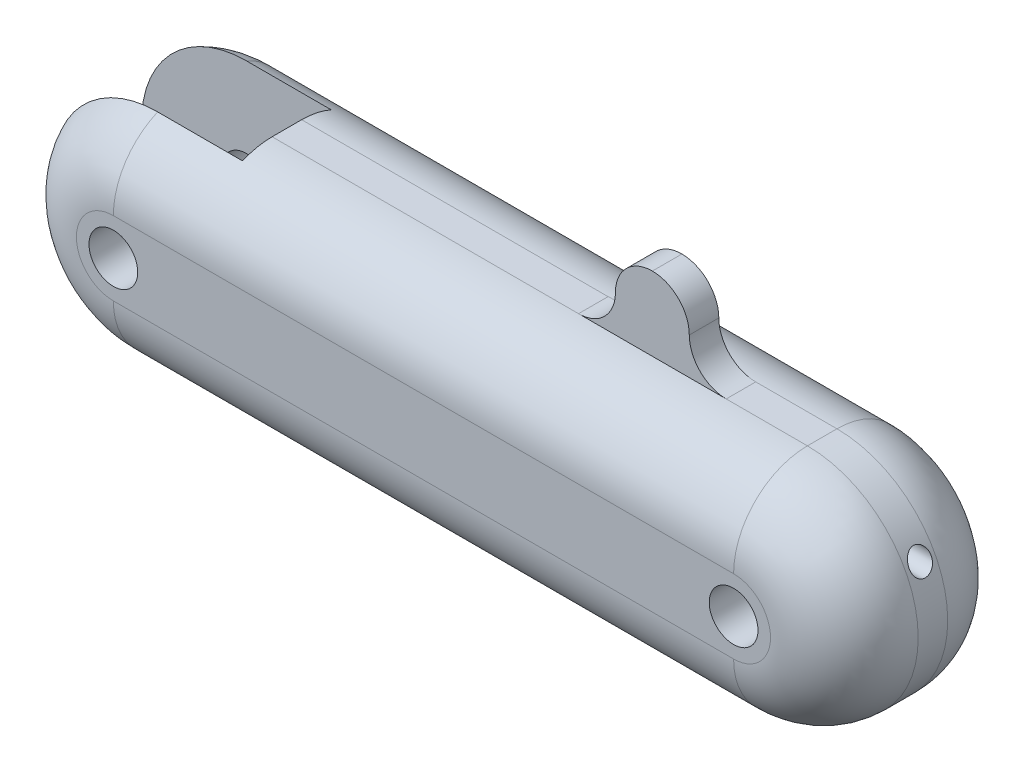
ISO-10303-21;
HEADER;
FILE_DESCRIPTION(('STEP AP214'),'2;1');
FILE_NAME('part.step','',(''),(''),'','','');
FILE_SCHEMA(('AUTOMOTIVE_DESIGN { 1 0 10303 214 1 1 1 1 }'));
ENDSEC;
DATA;
#1=APPLICATION_CONTEXT('core data for automotive mechanical design processes');
#2=APPLICATION_PROTOCOL_DEFINITION('international standard','automotive_design',2000,#1);
#3=PRODUCT_CONTEXT('',#1,'mechanical');
#4=PRODUCT('Part','Part','',(#3));
#5=PRODUCT_RELATED_PRODUCT_CATEGORY('part','',(#4));
#6=PRODUCT_DEFINITION_FORMATION('','',#4);
#7=PRODUCT_DEFINITION_CONTEXT('part definition',#1,'design');
#8=PRODUCT_DEFINITION('design','',#6,#7);
#9=PRODUCT_DEFINITION_SHAPE('','',#8);
#10=(LENGTH_UNIT() NAMED_UNIT(*) SI_UNIT(.MILLI.,.METRE.));
#11=(NAMED_UNIT(*) PLANE_ANGLE_UNIT() SI_UNIT($,.RADIAN.));
#12=(NAMED_UNIT(*) SI_UNIT($,.STERADIAN.) SOLID_ANGLE_UNIT());
#13=UNCERTAINTY_MEASURE_WITH_UNIT(LENGTH_MEASURE(1.E-05),#10,'distance_accuracy_value','');
#14=(GEOMETRIC_REPRESENTATION_CONTEXT(3) GLOBAL_UNCERTAINTY_ASSIGNED_CONTEXT((#13)) GLOBAL_UNIT_ASSIGNED_CONTEXT((#10,
#11,#12)) REPRESENTATION_CONTEXT('',''));
#15=CARTESIAN_POINT('',(0.,0.,0.));
#16=DIRECTION('',(0.,0.,1.));
#17=DIRECTION('',(1.,0.,0.));
#18=AXIS2_PLACEMENT_3D('',#15,#16,#17);
#19=CARTESIAN_POINT('',(-21.,0.,12.));
#20=DIRECTION('',(0.,-1.,0.));
#21=DIRECTION('',(1.,0.,0.));
#22=AXIS2_PLACEMENT_3D('',#19,#20,#21);
#23=PLANE('',#22);
#24=DIRECTION('',(-1.,0.,0.));
#25=VECTOR('',#24,1.);
#26=CARTESIAN_POINT('',(-21.,0.,7.));
#27=LINE('',#26,#25);
#28=CARTESIAN_POINT('',(-15.25,0.,7.));
#29=VERTEX_POINT('',#28);
#30=CARTESIAN_POINT('',(5.5,0.,7.));
#31=VERTEX_POINT('',#30);
#32=EDGE_CURVE('E400',#29,#31,#27,.F.);
#33=ORIENTED_EDGE('',*,*,#32,.T.);
#34=DIRECTION('',(0.,0.,1.));
#35=VECTOR('',#34,1.);
#36=CARTESIAN_POINT('',(5.5,0.,5.));
#37=LINE('',#36,#35);
#38=CARTESIAN_POINT('',(5.5,0.,5.));
#39=VERTEX_POINT('',#38);
#40=EDGE_CURVE('E302',#31,#39,#37,.F.);
#41=ORIENTED_EDGE('',*,*,#40,.T.);
#42=DIRECTION('',(-1.,0.,0.));
#43=VECTOR('',#42,1.);
#44=CARTESIAN_POINT('',(-21.,0.,5.));
#45=LINE('',#44,#43);
#46=CARTESIAN_POINT('',(-15.25,0.,5.));
#47=VERTEX_POINT('',#46);
#48=EDGE_CURVE('E402',#39,#47,#45,.T.);
#49=ORIENTED_EDGE('',*,*,#48,.T.);
#50=DIRECTION('',(0.,0.,1.));
#51=VECTOR('',#50,1.);
#52=CARTESIAN_POINT('',(-15.25,0.,3.));
#53=LINE('',#52,#51);
#54=EDGE_CURVE('E334',#47,#29,#53,.T.);
#55=ORIENTED_EDGE('',*,*,#54,.T.);
#56=EDGE_LOOP('',(#33,#41,#49,#55));
#57=FACE_BOUND('',#56,.T.);
#58=ADVANCED_FACE('F32',(#57),#23,.F.);
#59=CARTESIAN_POINT('',(21.,0.,5.));
#60=VERTEX_POINT('',#59);
#61=CARTESIAN_POINT('',(15.5,0.,5.));
#62=VERTEX_POINT('',#61);
#63=EDGE_CURVE('E403',#60,#62,#45,.T.);
#64=ORIENTED_EDGE('',*,*,#63,.T.);
#65=DIRECTION('',(0.,0.,-1.));
#66=VECTOR('',#65,1.);
#67=CARTESIAN_POINT('',(15.5,0.,7.));
#68=LINE('',#67,#66);
#69=CARTESIAN_POINT('',(15.5,0.,7.));
#70=VERTEX_POINT('',#69);
#71=EDGE_CURVE('E309',#62,#70,#68,.F.);
#72=ORIENTED_EDGE('',*,*,#71,.T.);
#73=CARTESIAN_POINT('',(21.,0.,7.));
#74=VERTEX_POINT('',#73);
#75=EDGE_CURVE('E399',#70,#74,#27,.F.);
#76=ORIENTED_EDGE('',*,*,#75,.T.);
#77=DIRECTION('',(0.,0.,-1.));
#78=VECTOR('',#77,1.);
#79=CARTESIAN_POINT('',(21.,0.,12.));
#80=LINE('',#79,#78);
#81=EDGE_CURVE('E364',#74,#60,#80,.T.);
#82=ORIENTED_EDGE('',*,*,#81,.T.);
#83=EDGE_LOOP('',(#64,#72,#76,#82));
#84=FACE_BOUND('',#83,.T.);
#85=ADVANCED_FACE('F251',(#84),#23,.F.);
#86=CARTESIAN_POINT('',(21.,-7.5,12.));
#87=DIRECTION('',(0.,0.,-1.));
#88=DIRECTION('',(-1.,0.,0.));
#89=AXIS2_PLACEMENT_3D('',#86,#87,#88);
#90=CYLINDRICAL_SURFACE('',#89,7.50000000000001);
#91=CARTESIAN_POINT('',(27.6332495807108,-4.,5.25));
#92=CARTESIAN_POINT('',(27.6568652100945,-4.04475712896393,5.25000069696609));
#93=CARTESIAN_POINT('',(27.6800293767484,-4.08976492895581,5.25400927517588));
#94=CARTESIAN_POINT('',(27.7248658777341,-4.1790551435472,5.27027538348579));
#95=CARTESIAN_POINT('',(27.7465380552073,-4.22333748150426,5.28253377946583));
#96=CARTESIAN_POINT('',(27.7879116758938,-4.30992682615475,5.31545723063562));
#97=CARTESIAN_POINT('',(27.8076045419242,-4.35222484491178,5.336157060362));
#98=CARTESIAN_POINT('',(27.8443674457023,-4.43298144567067,5.38577757165474));
#99=CARTESIAN_POINT('',(27.8614387598698,-4.47144189295035,5.41469423281491));
#100=CARTESIAN_POINT('',(27.8911623275913,-4.53973742839442,5.47736494318931));
#101=CARTESIAN_POINT('',(27.9040660292328,-4.57002664644258,5.51050419857445));
#102=CARTESIAN_POINT('',(27.9269531189977,-4.62455266895225,5.58231320481981));
#103=CARTESIAN_POINT('',(27.9369382953721,-4.64879317826637,5.62097954737949));
#104=CARTESIAN_POINT('',(27.9529869063967,-4.68817040363519,5.69891372918083));
#105=CARTESIAN_POINT('',(27.9593235719089,-4.70393268754241,5.73781010676271));
#106=CARTESIAN_POINT('',(27.9692604124838,-4.72879255774519,5.81800707831997));
#107=CARTESIAN_POINT('',(27.9728616243726,-4.73789266917448,5.85930675496975));
#108=CARTESIAN_POINT('',(27.9771383733366,-4.74871452689673,5.94068250069714));
#109=CARTESIAN_POINT('',(27.977964010453,-4.75081476114192,5.98070082955286));
#110=CARTESIAN_POINT('',(27.9770983322195,-4.7486184483497,6.06053083904639));
#111=CARTESIAN_POINT('',(27.9754073999443,-4.74432287488856,6.10034255021011));
#112=CARTESIAN_POINT('',(27.9695866751644,-4.72963511410702,6.17795271899596));
#113=CARTESIAN_POINT('',(27.9654973975342,-4.71934422356824,6.21577350399642));
#114=CARTESIAN_POINT('',(27.9549825205337,-4.69314838459035,6.28906769075068));
#115=CARTESIAN_POINT('',(27.9485568521372,-4.67724327028505,6.32454102311475));
#116=CARTESIAN_POINT('',(27.9333388667533,-4.6400662297977,6.39288228153309));
#117=CARTESIAN_POINT('',(27.9245047094671,-4.61869988546117,6.42568939411336));
#118=CARTESIAN_POINT('',(27.9046866646446,-4.57152680231289,6.48719637753227));
#119=CARTESIAN_POINT('',(27.8937023940896,-4.54571927245275,6.51589551500178));
#120=CARTESIAN_POINT('',(27.8691641560276,-4.48908949081757,6.57000258230612));
#121=CARTESIAN_POINT('',(27.8555068553954,-4.45807722125553,6.5951643464781));
#122=CARTESIAN_POINT('',(27.8263026183871,-4.39309447378724,6.63994971569263));
#123=CARTESIAN_POINT('',(27.8107550987679,-4.35912308374078,6.65957160512373));
#124=CARTESIAN_POINT('',(27.7767476900571,-4.28636850281494,6.69444106370555));
#125=CARTESIAN_POINT('',(27.7581540750848,-4.24741815677613,6.709208755228));
#126=CARTESIAN_POINT('',(27.71950375169,-4.16830211749591,6.73203260387971));
#127=CARTESIAN_POINT('',(27.6994464555126,-4.12813593985682,6.74008604853172));
#128=CARTESIAN_POINT('',(27.6563085373537,-4.04369983150148,6.75004397376913));
#129=CARTESIAN_POINT('',(27.6331223675881,-3.99940542782165,6.75128539519353));
#130=CARTESIAN_POINT('',(27.5860588230827,-3.91164199428551,6.74607476207137));
#131=CARTESIAN_POINT('',(27.5621811684306,-3.86817331081142,6.73961954823108));
#132=CARTESIAN_POINT('',(27.5124790173255,-3.77973344935155,6.71847576043198));
#133=CARTESIAN_POINT('',(27.486647679833,-3.73490877068937,6.7031853128459));
#134=CARTESIAN_POINT('',(27.4357343535149,-3.64852752977386,6.66423898345623));
#135=CARTESIAN_POINT('',(27.4106529100033,-3.60697331155975,6.64057716719651));
#136=CARTESIAN_POINT('',(27.3621650327383,-3.52822396654695,6.58503138384834));
#137=CARTESIAN_POINT('',(27.3387675581801,-3.49105156771564,6.55310707545874));
#138=CARTESIAN_POINT('',(27.2951208610375,-3.42285769464486,6.48149765334739));
#139=CARTESIAN_POINT('',(27.2748655342586,-3.39182426121488,6.44182793409188));
#140=CARTESIAN_POINT('',(27.2441296604099,-3.34531674164022,6.36773463912216));
#141=CARTESIAN_POINT('',(27.2325031742713,-3.32792254459538,6.33498389337065));
#142=CARTESIAN_POINT('',(27.2123269530317,-3.29793850852277,6.26646615448601));
#143=CARTESIAN_POINT('',(27.2037747168345,-3.28534476351841,6.23070164261997));
#144=CARTESIAN_POINT('',(27.1902984185428,-3.26557533684953,6.15681284743056));
#145=CARTESIAN_POINT('',(27.1853946024228,-3.2584298837293,6.11867665017429));
#146=CARTESIAN_POINT('',(27.1797033076017,-3.25014186597953,6.04145384644772));
#147=CARTESIAN_POINT('',(27.1789142561407,-3.2489970077805,6.00236760884515));
#148=CARTESIAN_POINT('',(27.1813931710046,-3.25260309406563,5.92827495646399));
#149=CARTESIAN_POINT('',(27.1842899276402,-3.25681456761362,5.8932277732572));
#150=CARTESIAN_POINT('',(27.193308211172,-3.26998861428829,5.82447604328705));
#151=CARTESIAN_POINT('',(27.1994299026124,-3.27895142984032,5.79077156512622));
#152=CARTESIAN_POINT('',(27.2146133796125,-3.30133780469566,5.72505739919943));
#153=CARTESIAN_POINT('',(27.2237143408386,-3.31482086291967,5.69307729890249));
#154=CARTESIAN_POINT('',(27.2443359325697,-3.3456514298456,5.63189268510943));
#155=CARTESIAN_POINT('',(27.255857406406,-3.36300028555895,5.60268914415963));
#156=CARTESIAN_POINT('',(27.2823887723703,-3.40338626249218,5.54395537476474));
#157=CARTESIAN_POINT('',(27.2976550846796,-3.42686421313566,5.51484516788648));
#158=CARTESIAN_POINT('',(27.3299678350555,-3.47726403649822,5.46091603715502));
#159=CARTESIAN_POINT('',(27.3470153888876,-3.50418807023977,5.43609982921319));
#160=CARTESIAN_POINT('',(27.3852466837685,-3.56551988782084,5.3872131735081));
#161=CARTESIAN_POINT('',(27.4066486852218,-3.60042939812047,5.3639419420298));
#162=CARTESIAN_POINT('',(27.4503628456514,-3.67317076129835,5.32367729284258));
#163=CARTESIAN_POINT('',(27.4726753450833,-3.71100371213012,5.30668624776824));
#164=CARTESIAN_POINT('',(27.5182375061319,-3.78991735324902,5.27877439425189));
#165=CARTESIAN_POINT('',(27.5414956207365,-3.83106029081338,5.26804311416663));
#166=CARTESIAN_POINT('',(27.5877229967265,-3.91472586515508,5.25365538695503));
#167=CARTESIAN_POINT('',(27.6106922419369,-3.95724857871951,5.24999933426715));
#168=CARTESIAN_POINT('',(27.6332495807108,-4.,5.25));
#169=B_SPLINE_CURVE_WITH_KNOTS('',3,(#91,#92,#93,#94,#95,#96,#97,#98,#99,#100,#101,#102,#103,
#104,#105,#106,#107,#108,#109,#110,#111,#112,#113,#114,#115,#116,#117,#118,#119,#120,#121,#122,
#123,#124,#125,#126,#127,#128,#129,#130,#131,#132,#133,#134,#135,#136,#137,#138,#139,#140,#141,
#142,#143,#144,#145,#146,#147,#148,#149,#150,#151,#152,#153,#154,#155,#156,#157,#158,#159,#160,
#161,#162,#163,#164,#165,#166,#167,#168),.UNSPECIFIED.,.T.,.F.,(4,2,2,2,2,2,2,2,2,2,2,2,2,2,2,2,
2,2,2,2,2,2,2,2,2,2,2,2,2,2,2,2,2,2,2,2,2,2,4),(0.,0.151661005421156,0.303337931279043,
0.4556461066209,0.60787988717372,0.747256765609742,0.886548064567126,1.0132272857131,
1.1398584673014,1.25952084912075,1.37916501767401,1.49684401087809,1.61452648107235,
1.73440026024666,1.85429541305983,1.98037574012025,2.1064950695399,2.24277688192367,
2.37911372392492,2.52851299639749,2.6779736149916,2.83907034561563,3.00028150715966,
3.1622951331674,3.32398996653117,3.44011001590394,3.55613537933344,3.67279988942347,
3.78941980432112,3.89517224873058,4.00093008941375,4.10813854282546,4.21538441088787,
4.33610582335719,4.45690331400404,4.59763975196048,4.73842930548273,4.88328582896064,
5.02815042784517),.UNSPECIFIED.);
#170=CARTESIAN_POINT('',(27.6332495807108,-4.,5.25));
#171=VERTEX_POINT('',#170);
#172=EDGE_CURVE('E180',#171,#171,#169,.T.);
#173=ORIENTED_EDGE('',*,*,#172,.T.);
#174=EDGE_LOOP('',(#173));
#175=FACE_BOUND('',#174,.T.);
#176=DIRECTION('',(0.,0.,-1.));
#177=VECTOR('',#176,1.);
#178=CARTESIAN_POINT('',(21.,-15.,12.));
#179=LINE('',#178,#177);
#180=CARTESIAN_POINT('',(21.,-15.,7.));
#181=VERTEX_POINT('',#180);
#182=CARTESIAN_POINT('',(21.,-15.,5.));
#183=VERTEX_POINT('',#182);
#184=EDGE_CURVE('E361',#181,#183,#179,.T.);
#185=ORIENTED_EDGE('',*,*,#184,.T.);
#186=CARTESIAN_POINT('',(21.,-7.5,5.));
#187=DIRECTION('',(0.,0.,-1.));
#188=DIRECTION('',(-1.,0.,0.));
#189=AXIS2_PLACEMENT_3D('',#186,#187,#188);
#190=CIRCLE('',#189,7.50000000000001);
#191=EDGE_CURVE('E371',#183,#60,#190,.F.);
#192=ORIENTED_EDGE('',*,*,#191,.T.);
#193=ORIENTED_EDGE('',*,*,#81,.F.);
#194=CARTESIAN_POINT('',(21.,-7.5,7.));
#195=DIRECTION('',(0.,0.,-1.));
#196=DIRECTION('',(-1.,0.,0.));
#197=AXIS2_PLACEMENT_3D('',#194,#195,#196);
#198=CIRCLE('',#197,7.50000000000001);
#199=EDGE_CURVE('E368',#74,#181,#198,.T.);
#200=ORIENTED_EDGE('',*,*,#199,.T.);
#201=EDGE_LOOP('',(#185,#192,#193,#200));
#202=FACE_BOUND('',#201,.T.);
#203=ADVANCED_FACE('F256',(#175,#202),#90,.T.);
#204=CARTESIAN_POINT('',(-21.,-15.,12.));
#205=DIRECTION('',(0.,1.,0.));
#206=DIRECTION('',(-1.,0.,0.));
#207=AXIS2_PLACEMENT_3D('',#204,#205,#206);
#208=PLANE('',#207);
#209=DIRECTION('',(0.,0.,1.));
#210=VECTOR('',#209,1.);
#211=CARTESIAN_POINT('',(15.,-15.,12.));
#212=LINE('',#211,#210);
#213=CARTESIAN_POINT('',(15.,-15.,5.25));
#214=VERTEX_POINT('',#213);
#215=CARTESIAN_POINT('',(15.,-15.,6.75));
#216=VERTEX_POINT('',#215);
#217=EDGE_CURVE('E11',#214,#216,#212,.T.);
#218=ORIENTED_EDGE('',*,*,#217,.F.);
#219=CARTESIAN_POINT('',(15.,-15.,5.25));
#220=CARTESIAN_POINT('',(14.7542632764226,-15.0000000000002,5.25004315767524));
#221=CARTESIAN_POINT('',(14.5085210026277,-15.0000000000001,5.25211489470871));
#222=CARTESIAN_POINT('',(14.0170842700288,-14.9999999999999,5.26060903777875));
#223=CARTESIAN_POINT('',(13.7713898199681,-14.9999999999997,5.26703194388829));
#224=CARTESIAN_POINT('',(13.2801575473098,-14.9999999999997,5.28452229658018));
#225=CARTESIAN_POINT('',(13.0346197291239,-14.9999999999999,5.29558986866137));
#226=CARTESIAN_POINT('',(12.5438278527665,-15.0000000000001,5.32304731635623));
#227=CARTESIAN_POINT('',(12.2985737973387,-15.,5.33943724300658));
#228=CARTESIAN_POINT('',(11.9311095685685,-15.,5.36898563672231));
#229=CARTESIAN_POINT('',(11.8086985585266,-15.,5.37966153468249));
#230=CARTESIAN_POINT('',(11.5640617208415,-15.,5.40294489732903));
#231=CARTESIAN_POINT('',(11.4418358875233,-15.,5.41555230156272));
#232=CARTESIAN_POINT('',(11.1976710295853,-15.,5.44308456415243));
#233=CARTESIAN_POINT('',(11.0757319477793,-15.,5.45800891202059));
#234=CARTESIAN_POINT('',(10.832133157837,-15.,5.49078869906144));
#235=CARTESIAN_POINT('',(10.7104737718776,-15.,5.50864659859199));
#236=CARTESIAN_POINT('',(10.5283531811736,-15.,5.53844271040164));
#237=CARTESIAN_POINT('',(10.4676477356162,-15.,5.54888814401165));
#238=CARTESIAN_POINT('',(10.3464611760695,-15.,5.57100214314213));
#239=CARTESIAN_POINT('',(10.2859800493206,-14.9999999999998,5.5826706379521));
#240=CARTESIAN_POINT('',(10.1654645261081,-15.0000000000002,5.60751857119837));
#241=CARTESIAN_POINT('',(10.105429443252,-15.0000000000006,5.62069466074211));
#242=CARTESIAN_POINT('',(9.98584710854059,-14.9999999999994,5.64905911347229));
#243=CARTESIAN_POINT('',(9.92629968486322,-14.9999999999976,5.66424673239583));
#244=CARTESIAN_POINT('',(9.83759445652908,-14.9999999999989,5.68920013125134));
#245=CARTESIAN_POINT('',(9.80813147071501,-14.9999999999999,5.69787899742414));
#246=CARTESIAN_POINT('',(9.74947176025281,-15.0000000000001,5.71615511337687));
#247=CARTESIAN_POINT('',(9.72027517858131,-14.9999999999992,5.72575282780179));
#248=CARTESIAN_POINT('',(9.66206765880573,-15.0000000000009,5.74621452347327));
#249=CARTESIAN_POINT('',(9.63305999984262,-15.0000000000035,5.75708789267815));
#250=CARTESIAN_POINT('',(9.5757308891777,-14.9999999999965,5.78047126839706));
#251=CARTESIAN_POINT('',(9.54740862064167,-14.9999999999869,5.79297920019201));
#252=CARTESIAN_POINT('',(9.50561067767142,-14.9999999999926,5.81370902307078));
#253=CARTESIAN_POINT('',(9.49168263898368,-14.999999999998,5.82101416974405));
#254=CARTESIAN_POINT('',(9.46429634400005,-15.000000000002,5.83645125665671));
#255=CARTESIAN_POINT('',(9.45083776621719,-15.0000000000005,5.84458261555731));
#256=CARTESIAN_POINT('',(9.42479590969791,-14.9999999999995,5.86184167879784));
#257=CARTESIAN_POINT('',(9.4122041814777,-14.9999999999999,5.87095650485631));
#258=CARTESIAN_POINT('',(9.38823302233475,-15.0000000000001,5.89064318323619));
#259=CARTESIAN_POINT('',(9.37684858284887,-15.,5.90120856214893));
#260=CARTESIAN_POINT('',(9.36157171336184,-15.,5.91847276563211));
#261=CARTESIAN_POINT('',(9.35681682035359,-15.,5.92439989378005));
#262=CARTESIAN_POINT('',(9.34809023962091,-15.,5.93681762202655));
#263=CARTESIAN_POINT('',(9.34411828323108,-15.,5.94330802773094));
#264=CARTESIAN_POINT('',(9.33784126565937,-15.,5.95575368398751));
#265=CARTESIAN_POINT('',(9.33536998781812,-15.,5.96162353545814));
#266=CARTESIAN_POINT('',(9.33143357016633,-15.,5.97368806842268));
#267=CARTESIAN_POINT('',(9.32996633089651,-15.,5.9798820427762));
#268=CARTESIAN_POINT('',(9.32820759973154,-15.,5.99249282216104));
#269=CARTESIAN_POINT('',(9.32792585333361,-15.,5.99891103849814));
#270=CARTESIAN_POINT('',(9.32860695991449,-15.,6.01168089456869));
#271=CARTESIAN_POINT('',(9.32957036409985,-15.,6.01803250356112));
#272=CARTESIAN_POINT('',(9.33274982982833,-15.,6.03103604449885));
#273=CARTESIAN_POINT('',(9.33507435339598,-15.,6.0376607267868));
#274=CARTESIAN_POINT('',(9.34076610506074,-15.,6.05045687932922));
#275=CARTESIAN_POINT('',(9.3441370394262,-15.,6.05662664062924));
#276=CARTESIAN_POINT('',(9.35405334953358,-15.,6.07229878612904));
#277=CARTESIAN_POINT('',(9.36124445421079,-15.,6.08138633178536));
#278=CARTESIAN_POINT('',(9.37682693448395,-15.,6.09844974069692));
#279=CARTESIAN_POINT('',(9.3852215657262,-15.,6.10642246880841));
#280=CARTESIAN_POINT('',(9.40689628310001,-15.,6.12506966268395));
#281=CARTESIAN_POINT('',(9.42060764317099,-15.0000000000001,6.13523606578463));
#282=CARTESIAN_POINT('',(9.44888069383961,-15.,6.15423820868835));
#283=CARTESIAN_POINT('',(9.46344204760791,-14.9999999999998,6.16307447068861));
#284=CARTESIAN_POINT('',(9.49318750570201,-15.0000000000002,6.1798266592675));
#285=CARTESIAN_POINT('',(9.50837464418253,-15.0000000000007,6.18773714733047));
#286=CARTESIAN_POINT('',(9.53911819730631,-14.9999999999993,6.20281029514463));
#287=CARTESIAN_POINT('',(9.554674763254,-14.9999999999974,6.20997264176654));
#288=CARTESIAN_POINT('',(9.6041483498945,-14.999999999995,6.23164085547265));
#289=CARTESIAN_POINT('',(9.63853081610993,-14.9999999999988,6.24508000563382));
#290=CARTESIAN_POINT('',(9.70794583664415,-15.0000000000013,6.27016631381346));
#291=CARTESIAN_POINT('',(9.74297879328614,-15.,6.28181231840784));
#292=CARTESIAN_POINT('',(9.81334955138804,-15.,6.30375615775861));
#293=CARTESIAN_POINT('',(9.84868616091628,-15.0000000000011,6.31405783760797));
#294=CARTESIAN_POINT('',(9.9196238097025,-14.9999999999989,6.33364909827311));
#295=CARTESIAN_POINT('',(9.95522476541043,-14.9999999999955,6.34293898545515));
#296=CARTESIAN_POINT('',(10.0621103253067,-14.9999999999917,6.36955343945088));
#297=CARTESIAN_POINT('',(10.1336911847246,-14.9999999999978,6.38568625057253));
#298=CARTESIAN_POINT('',(10.2773255497096,-15.0000000000022,6.41572840083133));
#299=CARTESIAN_POINT('',(10.3493791770273,-15.0000000000006,6.4296371417742));
#300=CARTESIAN_POINT('',(10.4938422570195,-14.9999999999994,6.45576118499702));
#301=CARTESIAN_POINT('',(10.5662519209116,-15.,6.46797531216262));
#302=CARTESIAN_POINT('',(10.7112894454931,-15.,6.49103863413266));
#303=CARTESIAN_POINT('',(10.7839173166957,-14.9999999999995,6.5018877620556));
#304=CARTESIAN_POINT('',(11.0017348809298,-14.9999999999989,6.53270498391579));
#305=CARTESIAN_POINT('',(11.1471620761869,-14.9999999999997,6.5509954741291));
#306=CARTESIAN_POINT('',(11.4383296374834,-15.0000000000003,6.58423813903129));
#307=CARTESIAN_POINT('',(11.5840698603133,-15.0000000000001,6.59919160472061));
#308=CARTESIAN_POINT('',(11.8757860812028,-14.9999999999999,6.62641006303086));
#309=CARTESIAN_POINT('',(12.0217620570142,-15.,6.63867529593591));
#310=CARTESIAN_POINT('',(12.313899357265,-15.,6.66093765903216));
#311=CARTESIAN_POINT('',(12.4600606987287,-14.9999999999998,6.67093456303059));
#312=CARTESIAN_POINT('',(12.7524902252265,-15.0000000000002,6.688935387613));
#313=CARTESIAN_POINT('',(12.8987583977622,-15.0000000000007,6.69693951253779));
#314=CARTESIAN_POINT('',(13.1913766306375,-14.9999999999993,6.71114565025945));
#315=CARTESIAN_POINT('',(13.337726688452,-14.9999999999974,6.71734771585628));
#316=CARTESIAN_POINT('',(13.7366362941538,-14.999999999996,6.73198075836264));
#317=CARTESIAN_POINT('',(13.9892580451749,-14.9999999999992,6.73876681460299));
#318=CARTESIAN_POINT('',(14.3682512852977,-15.0000000000004,6.74552286132389));
#319=CARTESIAN_POINT('',(14.4945958600704,-15.0000000000002,6.7472043698137));
#320=CARTESIAN_POINT('',(14.7472932847725,-14.9999999999998,6.7494421237718));
#321=CARTESIAN_POINT('',(14.8736461345664,-14.9999999999996,6.7499983844973));
#322=CARTESIAN_POINT('',(15.,-15.,6.75));
#323=B_SPLINE_CURVE_WITH_KNOTS('',3,(#219,#220,#221,#222,#223,#224,#225,#226,#227,#228,#229,
#230,#231,#232,#233,#234,#235,#236,#237,#238,#239,#240,#241,#242,#243,#244,#245,#246,#247,#248,
#249,#250,#251,#252,#253,#254,#255,#256,#257,#258,#259,#260,#261,#262,#263,#264,#265,#266,#267,
#268,#269,#270,#271,#272,#273,#274,#275,#276,#277,#278,#279,#280,#281,#282,#283,#284,#285,#286,
#287,#288,#289,#290,#291,#292,#293,#294,#295,#296,#297,#298,#299,#300,#301,#302,#303,#304,#305,
#306,#307,#308,#309,#310,#311,#312,#313,#314,#315,#316,#317,#318,#319,#320,#321,#322),
.UNSPECIFIED.,.F.,.F.,(4,2,2,2,2,2,2,2,2,2,2,2,2,2,2,2,2,2,2,2,2,2,2,2,2,2,2,2,2,2,2,2,2,2,2,2,
2,2,2,2,2,2,2,2,2,2,2,2,2,2,2,4),(0.,0.73721069166571,1.47450612416738,2.21182147966963,
2.94914390558577,3.31775932907967,3.68636321793168,4.054886007937,4.42371946948564,
4.60850293379574,4.79327572085452,4.97764575267944,5.16194775744851,5.25408123910737,
5.34626155960435,5.43916873559537,5.5319591113235,5.5791225855331,5.62625310144504,
5.67282790587056,5.71920123570758,5.74195383120452,5.76469860548412,5.78373330964406,
5.80272808933095,5.82187871663364,5.8410378244913,5.86198403819212,5.88300530421816,
5.91757439860104,5.95223883450741,6.00331567861571,6.05437241798512,6.10571545235408,
6.15707989059781,6.2677352562988,6.37846150531434,6.48886376456766,6.59923250102891,
6.81930230584812,7.03943120226812,7.25971199016106,7.4800035670537,7.91966296833928,
8.35915198182148,8.79860169612663,9.23809521215131,9.67754364366062,10.1169791981248,
10.8750653325232,11.2541287517806,11.633187031286),.UNSPECIFIED.);
#324=EDGE_CURVE('E172',#214,#216,#323,.T.);
#325=ORIENTED_EDGE('',*,*,#324,.T.);
#326=EDGE_LOOP('',(#218,#325));
#327=FACE_BOUND('',#326,.T.);
#328=DIRECTION('',(1.,0.,0.));
#329=VECTOR('',#328,1.);
#330=CARTESIAN_POINT('',(-21.,-15.,7.));
#331=LINE('',#330,#329);
#332=CARTESIAN_POINT('',(-15.25,-15.,7.));
#333=VERTEX_POINT('',#332);
#334=EDGE_CURVE('E384',#181,#333,#331,.F.);
#335=ORIENTED_EDGE('',*,*,#334,.T.);
#336=DIRECTION('',(0.,0.,-1.));
#337=VECTOR('',#336,1.);
#338=CARTESIAN_POINT('',(-15.25,-15.,12.));
#339=LINE('',#338,#337);
#340=CARTESIAN_POINT('',(-15.25,-15.,5.));
#341=VERTEX_POINT('',#340);
#342=EDGE_CURVE('E349',#333,#341,#339,.T.);
#343=ORIENTED_EDGE('',*,*,#342,.T.);
#344=DIRECTION('',(1.,0.,0.));
#345=VECTOR('',#344,1.);
#346=CARTESIAN_POINT('',(21.,-15.,5.));
#347=LINE('',#346,#345);
#348=EDGE_CURVE('E387',#341,#183,#347,.T.);
#349=ORIENTED_EDGE('',*,*,#348,.T.);
#350=ORIENTED_EDGE('',*,*,#184,.F.);
#351=EDGE_LOOP('',(#335,#343,#349,#350));
#352=FACE_BOUND('',#351,.T.);
#353=ADVANCED_FACE('F175',(#327,#352),#208,.F.);
#354=CARTESIAN_POINT('',(21.,-7.5,12.));
#355=DIRECTION('',(0.,0.,-1.));
#356=DIRECTION('',(-1.,0.,0.));
#357=AXIS2_PLACEMENT_3D('',#354,#355,#356);
#358=PLANE('',#357);
#359=CARTESIAN_POINT('',(21.,-7.50000000000001,12.));
#360=DIRECTION('',(0.,0.,1.));
#361=DIRECTION('',(1.,0.,0.));
#362=AXIS2_PLACEMENT_3D('',#359,#360,#361);
#363=CIRCLE('',#362,1.65);
#364=CARTESIAN_POINT('',(22.65,-7.50000000000001,12.));
#365=VERTEX_POINT('',#364);
#366=EDGE_CURVE('E330',#365,#365,#363,.T.);
#367=ORIENTED_EDGE('',*,*,#366,.F.);
#368=EDGE_LOOP('',(#367));
#369=FACE_BOUND('',#368,.T.);
#370=CARTESIAN_POINT('',(-21.,-7.50000000000001,12.));
#371=DIRECTION('',(0.,0.,1.));
#372=DIRECTION('',(1.,0.,0.));
#373=AXIS2_PLACEMENT_3D('',#370,#371,#372);
#374=CIRCLE('',#373,1.65);
#375=CARTESIAN_POINT('',(-19.35,-7.50000000000001,12.));
#376=VERTEX_POINT('',#375);
#377=EDGE_CURVE('E323',#376,#376,#374,.T.);
#378=ORIENTED_EDGE('',*,*,#377,.F.);
#379=EDGE_LOOP('',(#378));
#380=FACE_BOUND('',#379,.T.);
#381=DIRECTION('',(1.,0.,0.));
#382=VECTOR('',#381,1.);
#383=CARTESIAN_POINT('',(21.,-10.,12.));
#384=LINE('',#383,#382);
#385=CARTESIAN_POINT('',(-21.,-10.,12.));
#386=VERTEX_POINT('',#385);
#387=CARTESIAN_POINT('',(21.,-10.,12.));
#388=VERTEX_POINT('',#387);
#389=EDGE_CURVE('E394',#386,#388,#384,.T.);
#390=ORIENTED_EDGE('',*,*,#389,.T.);
#391=CARTESIAN_POINT('',(21.,-7.5,12.));
#392=DIRECTION('',(0.,0.,-1.));
#393=DIRECTION('',(-1.,0.,0.));
#394=AXIS2_PLACEMENT_3D('',#391,#392,#393);
#395=CIRCLE('',#394,2.5);
#396=CARTESIAN_POINT('',(21.,-4.99999999999999,12.));
#397=VERTEX_POINT('',#396);
#398=EDGE_CURVE('E396',#388,#397,#395,.F.);
#399=ORIENTED_EDGE('',*,*,#398,.T.);
#400=DIRECTION('',(-1.,0.,0.));
#401=VECTOR('',#400,1.);
#402=CARTESIAN_POINT('',(21.,-4.99999999999999,12.));
#403=LINE('',#402,#401);
#404=CARTESIAN_POINT('',(-21.,-5.,12.));
#405=VERTEX_POINT('',#404);
#406=EDGE_CURVE('E389',#397,#405,#403,.T.);
#407=ORIENTED_EDGE('',*,*,#406,.T.);
#408=CARTESIAN_POINT('',(-21.,-7.5,12.));
#409=DIRECTION('',(0.,0.,-1.));
#410=DIRECTION('',(-1.,0.,0.));
#411=AXIS2_PLACEMENT_3D('',#408,#409,#410);
#412=CIRCLE('',#411,2.5);
#413=EDGE_CURVE('E392',#405,#386,#412,.F.);
#414=ORIENTED_EDGE('',*,*,#413,.T.);
#415=EDGE_LOOP('',(#390,#399,#407,#414));
#416=FACE_BOUND('',#415,.T.);
#417=ADVANCED_FACE('F235',(#369,#380,#416),#358,.F.);
#418=CARTESIAN_POINT('',(21.,-7.5,0.));
#419=DIRECTION('',(0.,0.,-1.));
#420=DIRECTION('',(-1.,0.,0.));
#421=AXIS2_PLACEMENT_3D('',#418,#419,#420);
#422=PLANE('',#421);
#423=CARTESIAN_POINT('',(21.,-7.50000000000001,0.));
#424=DIRECTION('',(0.,0.,1.));
#425=DIRECTION('',(1.,0.,0.));
#426=AXIS2_PLACEMENT_3D('',#423,#424,#425);
#427=CIRCLE('',#426,1.65);
#428=CARTESIAN_POINT('',(22.65,-7.50000000000001,0.));
#429=VERTEX_POINT('',#428);
#430=EDGE_CURVE('E327',#429,#429,#427,.T.);
#431=ORIENTED_EDGE('',*,*,#430,.T.);
#432=EDGE_LOOP('',(#431));
#433=FACE_BOUND('',#432,.T.);
#434=CARTESIAN_POINT('',(-21.,-7.50000000000001,0.));
#435=DIRECTION('',(0.,0.,1.));
#436=DIRECTION('',(1.,0.,0.));
#437=AXIS2_PLACEMENT_3D('',#434,#435,#436);
#438=CIRCLE('',#437,1.65);
#439=CARTESIAN_POINT('',(-19.35,-7.50000000000001,0.));
#440=VERTEX_POINT('',#439);
#441=EDGE_CURVE('E317',#440,#440,#438,.T.);
#442=ORIENTED_EDGE('',*,*,#441,.T.);
#443=EDGE_LOOP('',(#442));
#444=FACE_BOUND('',#443,.T.);
#445=DIRECTION('',(-1.,0.,0.));
#446=VECTOR('',#445,1.);
#447=CARTESIAN_POINT('',(21.,-4.99999999999999,0.));
#448=LINE('',#447,#446);
#449=CARTESIAN_POINT('',(-21.,-5.,0.));
#450=VERTEX_POINT('',#449);
#451=CARTESIAN_POINT('',(21.,-4.99999999999999,0.));
#452=VERTEX_POINT('',#451);
#453=EDGE_CURVE('E374',#450,#452,#448,.F.);
#454=ORIENTED_EDGE('',*,*,#453,.T.);
#455=CARTESIAN_POINT('',(21.,-7.5,0.));
#456=DIRECTION('',(0.,0.,-1.));
#457=DIRECTION('',(-1.,0.,0.));
#458=AXIS2_PLACEMENT_3D('',#455,#456,#457);
#459=CIRCLE('',#458,2.5);
#460=CARTESIAN_POINT('',(21.,-10.,0.));
#461=VERTEX_POINT('',#460);
#462=EDGE_CURVE('E381',#452,#461,#459,.T.);
#463=ORIENTED_EDGE('',*,*,#462,.T.);
#464=DIRECTION('',(1.,0.,0.));
#465=VECTOR('',#464,1.);
#466=CARTESIAN_POINT('',(-21.,-10.,0.));
#467=LINE('',#466,#465);
#468=CARTESIAN_POINT('',(-21.,-10.,0.));
#469=VERTEX_POINT('',#468);
#470=EDGE_CURVE('E378',#461,#469,#467,.F.);
#471=ORIENTED_EDGE('',*,*,#470,.T.);
#472=CARTESIAN_POINT('',(-21.,-7.5,0.));
#473=DIRECTION('',(0.,0.,-1.));
#474=DIRECTION('',(-1.,0.,0.));
#475=AXIS2_PLACEMENT_3D('',#472,#473,#474);
#476=CIRCLE('',#475,2.5);
#477=EDGE_CURVE('E376',#469,#450,#476,.T.);
#478=ORIENTED_EDGE('',*,*,#477,.T.);
#479=EDGE_LOOP('',(#454,#463,#471,#478));
#480=FACE_BOUND('',#479,.T.);
#481=ADVANCED_FACE('F237',(#433,#444,#480),#422,.T.);
#482=CARTESIAN_POINT('',(-21.,-7.5,5.));
#483=DIRECTION('',(0.,0.,-1.));
#484=DIRECTION('',(-1.,0.,0.));
#485=AXIS2_PLACEMENT_3D('',#482,#483,#484);
#486=DEGENERATE_TOROIDAL_SURFACE('',#485,2.5,5.,.T.);
#487=CARTESIAN_POINT('',(-21.,-7.5,3.));
#488=DIRECTION('',(0.,0.,-1.));
#489=DIRECTION('',(-1.,0.,0.));
#490=AXIS2_PLACEMENT_3D('',#487,#488,#489);
#491=CIRCLE('',#490,7.08257569495584);
#492=CARTESIAN_POINT('',(-21.,-0.417424305044161,3.));
#493=VERTEX_POINT('',#492);
#494=CARTESIAN_POINT('',(-21.,-14.5825756949558,3.));
#495=VERTEX_POINT('',#494);
#496=EDGE_CURVE('E356',#493,#495,#491,.F.);
#497=ORIENTED_EDGE('',*,*,#496,.F.);
#498=CARTESIAN_POINT('',(-21.,-5.,5.));
#499=DIRECTION('',(1.,0.,0.));
#500=DIRECTION('',(0.,1.,0.));
#501=AXIS2_PLACEMENT_3D('',#498,#499,#500);
#502=CIRCLE('',#501,5.);
#503=EDGE_CURVE('E411',#450,#493,#502,.T.);
#504=ORIENTED_EDGE('',*,*,#503,.F.);
#505=ORIENTED_EDGE('',*,*,#477,.F.);
#506=CARTESIAN_POINT('',(-21.,-10.,5.));
#507=DIRECTION('',(1.,0.,0.));
#508=DIRECTION('',(0.,0.,-1.));
#509=AXIS2_PLACEMENT_3D('',#506,#507,#508);
#510=CIRCLE('',#509,5.);
#511=EDGE_CURVE('E365',#495,#469,#510,.T.);
#512=ORIENTED_EDGE('',*,*,#511,.F.);
#513=EDGE_LOOP('',(#497,#504,#505,#512));
#514=FACE_BOUND('',#513,.T.);
#515=ADVANCED_FACE('F240',(#514),#486,.T.);
#516=CARTESIAN_POINT('',(-21.,-10.,5.));
#517=DIRECTION('',(-1.,0.,0.));
#518=DIRECTION('',(0.,-1.,0.));
#519=AXIS2_PLACEMENT_3D('',#516,#517,#518);
#520=CYLINDRICAL_SURFACE('',#519,5.);
#521=CARTESIAN_POINT('',(-15.25,-10.,5.));
#522=DIRECTION('',(1.,0.,0.));
#523=DIRECTION('',(0.,0.,-1.));
#524=AXIS2_PLACEMENT_3D('',#521,#522,#523);
#525=CIRCLE('',#524,5.);
#526=CARTESIAN_POINT('',(-15.25,-14.5825756949558,3.));
#527=VERTEX_POINT('',#526);
#528=EDGE_CURVE('E352',#527,#341,#525,.F.);
#529=ORIENTED_EDGE('',*,*,#528,.F.);
#530=DIRECTION('',(-1.,0.,0.));
#531=VECTOR('',#530,1.);
#532=CARTESIAN_POINT('',(-21.,-14.5825756949558,3.));
#533=LINE('',#532,#531);
#534=EDGE_CURVE('E358',#495,#527,#533,.F.);
#535=ORIENTED_EDGE('',*,*,#534,.F.);
#536=ORIENTED_EDGE('',*,*,#511,.T.);
#537=ORIENTED_EDGE('',*,*,#470,.F.);
#538=CARTESIAN_POINT('',(21.,-10.,5.));
#539=DIRECTION('',(1.,0.,0.));
#540=DIRECTION('',(0.,0.,-1.));
#541=AXIS2_PLACEMENT_3D('',#538,#539,#540);
#542=CIRCLE('',#541,5.);
#543=EDGE_CURVE('E408',#183,#461,#542,.T.);
#544=ORIENTED_EDGE('',*,*,#543,.F.);
#545=ORIENTED_EDGE('',*,*,#348,.F.);
#546=EDGE_LOOP('',(#529,#535,#536,#537,#544,#545));
#547=FACE_BOUND('',#546,.T.);
#548=ADVANCED_FACE('F245',(#547),#520,.T.);
#549=CARTESIAN_POINT('',(-21.,-5.,5.));
#550=DIRECTION('',(1.,0.,0.));
#551=DIRECTION('',(0.,1.,0.));
#552=AXIS2_PLACEMENT_3D('',#549,#550,#551);
#553=CYLINDRICAL_SURFACE('',#552,5.);
#554=CARTESIAN_POINT('',(-15.25,-5.,5.));
#555=DIRECTION('',(1.,0.,0.));
#556=DIRECTION('',(0.,0.,-1.));
#557=AXIS2_PLACEMENT_3D('',#554,#555,#556);
#558=CIRCLE('',#557,5.);
#559=CARTESIAN_POINT('',(-15.25,-0.41742430504416,3.));
#560=VERTEX_POINT('',#559);
#561=EDGE_CURVE('E354',#47,#560,#558,.F.);
#562=ORIENTED_EDGE('',*,*,#561,.F.);
#563=ORIENTED_EDGE('',*,*,#48,.F.);
#564=DIRECTION('',(-1.,0.,0.));
#565=VECTOR('',#564,1.);
#566=CARTESIAN_POINT('',(8.,0.,5.));
#567=LINE('',#566,#565);
#568=EDGE_CURVE('E54',#62,#39,#567,.T.);
#569=ORIENTED_EDGE('',*,*,#568,.F.);
#570=ORIENTED_EDGE('',*,*,#63,.F.);
#571=CARTESIAN_POINT('',(21.,-4.99999999999999,5.));
#572=DIRECTION('',(1.,0.,0.));
#573=DIRECTION('',(0.,0.,-1.));
#574=AXIS2_PLACEMENT_3D('',#571,#572,#573);
#575=CIRCLE('',#574,5.);
#576=EDGE_CURVE('E406',#452,#60,#575,.T.);
#577=ORIENTED_EDGE('',*,*,#576,.F.);
#578=ORIENTED_EDGE('',*,*,#453,.F.);
#579=ORIENTED_EDGE('',*,*,#503,.T.);
#580=DIRECTION('',(1.,0.,0.));
#581=VECTOR('',#580,1.);
#582=CARTESIAN_POINT('',(-21.,-0.417424305044161,3.));
#583=LINE('',#582,#581);
#584=EDGE_CURVE('E425',#560,#493,#583,.F.);
#585=ORIENTED_EDGE('',*,*,#584,.F.);
#586=EDGE_LOOP('',(#562,#563,#569,#570,#577,#578,#579,#585));
#587=FACE_BOUND('',#586,.T.);
#588=ADVANCED_FACE('F267',(#587),#553,.T.);
#589=CARTESIAN_POINT('',(21.,-7.5,5.));
#590=DIRECTION('',(0.,0.,-1.));
#591=DIRECTION('',(-1.,0.,0.));
#592=AXIS2_PLACEMENT_3D('',#589,#590,#591);
#593=DEGENERATE_TOROIDAL_SURFACE('',#592,2.5,5.,.T.);
#594=ORIENTED_EDGE('',*,*,#543,.T.);
#595=ORIENTED_EDGE('',*,*,#462,.F.);
#596=ORIENTED_EDGE('',*,*,#576,.T.);
#597=ORIENTED_EDGE('',*,*,#191,.F.);
#598=EDGE_LOOP('',(#594,#595,#596,#597));
#599=FACE_BOUND('',#598,.T.);
#600=ADVANCED_FACE('F263',(#599),#593,.T.);
#601=CARTESIAN_POINT('',(-21.,-7.5,7.));
#602=DIRECTION('',(0.,0.,-1.));
#603=DIRECTION('',(-1.,0.,0.));
#604=AXIS2_PLACEMENT_3D('',#601,#602,#603);
#605=DEGENERATE_TOROIDAL_SURFACE('',#604,2.5,5.,.T.);
#606=CARTESIAN_POINT('',(-21.,-7.5,9.));
#607=DIRECTION('',(0.,0.,1.));
#608=DIRECTION('',(1.,0.,0.));
#609=AXIS2_PLACEMENT_3D('',#606,#607,#608);
#610=CIRCLE('',#609,7.08257569495584);
#611=CARTESIAN_POINT('',(-21.,-14.5825756949558,9.));
#612=VERTEX_POINT('',#611);
#613=CARTESIAN_POINT('',(-21.,-0.417424305044161,9.));
#614=VERTEX_POINT('',#613);
#615=EDGE_CURVE('E341',#612,#614,#610,.F.);
#616=ORIENTED_EDGE('',*,*,#615,.F.);
#617=CARTESIAN_POINT('',(-21.,-10.,7.));
#618=DIRECTION('',(1.,0.,0.));
#619=DIRECTION('',(0.,0.,-1.));
#620=AXIS2_PLACEMENT_3D('',#617,#618,#619);
#621=CIRCLE('',#620,5.);
#622=EDGE_CURVE('E409',#386,#612,#621,.T.);
#623=ORIENTED_EDGE('',*,*,#622,.F.);
#624=ORIENTED_EDGE('',*,*,#413,.F.);
#625=CARTESIAN_POINT('',(-21.,-5.,7.));
#626=DIRECTION('',(1.,0.,0.));
#627=DIRECTION('',(0.,1.,0.));
#628=AXIS2_PLACEMENT_3D('',#625,#626,#627);
#629=CIRCLE('',#628,5.);
#630=EDGE_CURVE('E418',#614,#405,#629,.T.);
#631=ORIENTED_EDGE('',*,*,#630,.F.);
#632=EDGE_LOOP('',(#616,#623,#624,#631));
#633=FACE_BOUND('',#632,.T.);
#634=ADVANCED_FACE('F266',(#633),#605,.T.);
#635=CARTESIAN_POINT('',(21.,-10.,7.));
#636=DIRECTION('',(1.,0.,0.));
#637=DIRECTION('',(0.,1.,0.));
#638=AXIS2_PLACEMENT_3D('',#635,#636,#637);
#639=CYLINDRICAL_SURFACE('',#638,5.);
#640=CARTESIAN_POINT('',(-15.25,-10.,7.));
#641=DIRECTION('',(1.,0.,0.));
#642=DIRECTION('',(0.,0.,-1.));
#643=AXIS2_PLACEMENT_3D('',#640,#641,#642);
#644=CIRCLE('',#643,5.);
#645=CARTESIAN_POINT('',(-15.25,-14.5825756949558,9.));
#646=VERTEX_POINT('',#645);
#647=EDGE_CURVE('E347',#333,#646,#644,.F.);
#648=ORIENTED_EDGE('',*,*,#647,.F.);
#649=ORIENTED_EDGE('',*,*,#334,.F.);
#650=CARTESIAN_POINT('',(21.,-10.,7.));
#651=DIRECTION('',(1.,0.,0.));
#652=DIRECTION('',(0.,0.,-1.));
#653=AXIS2_PLACEMENT_3D('',#650,#651,#652);
#654=CIRCLE('',#653,5.);
#655=EDGE_CURVE('E416',#388,#181,#654,.T.);
#656=ORIENTED_EDGE('',*,*,#655,.F.);
#657=ORIENTED_EDGE('',*,*,#389,.F.);
#658=ORIENTED_EDGE('',*,*,#622,.T.);
#659=DIRECTION('',(1.,0.,0.));
#660=VECTOR('',#659,1.);
#661=CARTESIAN_POINT('',(21.,-14.5825756949558,9.));
#662=LINE('',#661,#660);
#663=EDGE_CURVE('E345',#646,#612,#662,.F.);
#664=ORIENTED_EDGE('',*,*,#663,.F.);
#665=EDGE_LOOP('',(#648,#649,#656,#657,#658,#664));
#666=FACE_BOUND('',#665,.T.);
#667=ADVANCED_FACE('F280',(#666),#639,.T.);
#668=CARTESIAN_POINT('',(21.,-4.99999999999999,7.));
#669=DIRECTION('',(-1.,0.,0.));
#670=DIRECTION('',(0.,-1.,0.));
#671=AXIS2_PLACEMENT_3D('',#668,#669,#670);
#672=CYLINDRICAL_SURFACE('',#671,5.);
#673=CARTESIAN_POINT('',(-15.25,-5.,7.));
#674=DIRECTION('',(1.,0.,0.));
#675=DIRECTION('',(0.,0.,-1.));
#676=AXIS2_PLACEMENT_3D('',#673,#674,#675);
#677=CIRCLE('',#676,5.);
#678=CARTESIAN_POINT('',(-15.25,-0.417424305044161,9.));
#679=VERTEX_POINT('',#678);
#680=EDGE_CURVE('E423',#679,#29,#677,.F.);
#681=ORIENTED_EDGE('',*,*,#680,.F.);
#682=DIRECTION('',(-1.,0.,0.));
#683=VECTOR('',#682,1.);
#684=CARTESIAN_POINT('',(21.,-0.417424305044154,9.));
#685=LINE('',#684,#683);
#686=EDGE_CURVE('E405',#614,#679,#685,.F.);
#687=ORIENTED_EDGE('',*,*,#686,.F.);
#688=ORIENTED_EDGE('',*,*,#630,.T.);
#689=ORIENTED_EDGE('',*,*,#406,.F.);
#690=CARTESIAN_POINT('',(21.,-4.99999999999999,7.));
#691=DIRECTION('',(1.,0.,0.));
#692=DIRECTION('',(0.,0.,-1.));
#693=AXIS2_PLACEMENT_3D('',#690,#691,#692);
#694=CIRCLE('',#693,5.);
#695=EDGE_CURVE('E360',#74,#397,#694,.T.);
#696=ORIENTED_EDGE('',*,*,#695,.F.);
#697=ORIENTED_EDGE('',*,*,#75,.F.);
#698=DIRECTION('',(1.,0.,0.));
#699=VECTOR('',#698,1.);
#700=CARTESIAN_POINT('',(8.,0.,7.));
#701=LINE('',#700,#699);
#702=EDGE_CURVE('E65',#31,#70,#701,.T.);
#703=ORIENTED_EDGE('',*,*,#702,.F.);
#704=ORIENTED_EDGE('',*,*,#32,.F.);
#705=EDGE_LOOP('',(#681,#687,#688,#689,#696,#697,#703,#704));
#706=FACE_BOUND('',#705,.T.);
#707=ADVANCED_FACE('F276',(#706),#672,.T.);
#708=CARTESIAN_POINT('',(21.,-7.5,7.));
#709=DIRECTION('',(0.,0.,-1.));
#710=DIRECTION('',(-1.,0.,0.));
#711=AXIS2_PLACEMENT_3D('',#708,#709,#710);
#712=DEGENERATE_TOROIDAL_SURFACE('',#711,2.5,5.,.T.);
#713=ORIENTED_EDGE('',*,*,#655,.T.);
#714=ORIENTED_EDGE('',*,*,#199,.F.);
#715=ORIENTED_EDGE('',*,*,#695,.T.);
#716=ORIENTED_EDGE('',*,*,#398,.F.);
#717=EDGE_LOOP('',(#713,#714,#715,#716));
#718=FACE_BOUND('',#717,.T.);
#719=ADVANCED_FACE('F233',(#718),#712,.T.);
#720=CARTESIAN_POINT('',(-15.25,0.,3.));
#721=DIRECTION('',(1.,0.,0.));
#722=DIRECTION('',(0.,0.,-1.));
#723=AXIS2_PLACEMENT_3D('',#720,#721,#722);
#724=PLANE('',#723);
#725=CARTESIAN_POINT('',(-15.25,-11.,6.));
#726=DIRECTION('',(-1.,0.,0.));
#727=DIRECTION('',(0.,0.,1.));
#728=AXIS2_PLACEMENT_3D('',#725,#726,#727);
#729=CIRCLE('',#728,0.75);
#730=CARTESIAN_POINT('',(-15.25,-11.,6.75));
#731=VERTEX_POINT('',#730);
#732=EDGE_CURVE('E173',#731,#731,#729,.T.);
#733=ORIENTED_EDGE('',*,*,#732,.F.);
#734=EDGE_LOOP('',(#733));
#735=FACE_BOUND('',#734,.T.);
#736=CARTESIAN_POINT('',(-15.25,-4.,6.));
#737=DIRECTION('',(1.,0.,0.));
#738=DIRECTION('',(0.,0.,-1.));
#739=AXIS2_PLACEMENT_3D('',#736,#737,#738);
#740=CIRCLE('',#739,0.75);
#741=CARTESIAN_POINT('',(-15.25,-4.,5.25));
#742=VERTEX_POINT('',#741);
#743=EDGE_CURVE('E177',#742,#742,#740,.T.);
#744=ORIENTED_EDGE('',*,*,#743,.T.);
#745=EDGE_LOOP('',(#744));
#746=FACE_BOUND('',#745,.T.);
#747=ORIENTED_EDGE('',*,*,#561,.T.);
#748=DIRECTION('',(0.,-1.,0.));
#749=VECTOR('',#748,1.);
#750=CARTESIAN_POINT('',(-15.25,0.,3.));
#751=LINE('',#750,#749);
#752=EDGE_CURVE('E338',#560,#527,#751,.T.);
#753=ORIENTED_EDGE('',*,*,#752,.T.);
#754=ORIENTED_EDGE('',*,*,#528,.T.);
#755=ORIENTED_EDGE('',*,*,#342,.F.);
#756=ORIENTED_EDGE('',*,*,#647,.T.);
#757=DIRECTION('',(0.,-1.,0.));
#758=VECTOR('',#757,1.);
#759=CARTESIAN_POINT('',(-15.25,0.,9.));
#760=LINE('',#759,#758);
#761=EDGE_CURVE('E337',#679,#646,#760,.T.);
#762=ORIENTED_EDGE('',*,*,#761,.F.);
#763=ORIENTED_EDGE('',*,*,#680,.T.);
#764=ORIENTED_EDGE('',*,*,#54,.F.);
#765=EDGE_LOOP('',(#747,#753,#754,#755,#756,#762,#763,#764));
#766=FACE_BOUND('',#765,.T.);
#767=ADVANCED_FACE('F226',(#735,#746,#766),#724,.F.);
#768=CARTESIAN_POINT('',(-15.25,0.,3.));
#769=DIRECTION('',(0.,0.,-1.));
#770=DIRECTION('',(-1.,0.,0.));
#771=AXIS2_PLACEMENT_3D('',#768,#769,#770);
#772=PLANE('',#771);
#773=CARTESIAN_POINT('',(-21.,-7.50000000000001,3.));
#774=DIRECTION('',(0.,0.,-1.));
#775=DIRECTION('',(-1.,0.,0.));
#776=AXIS2_PLACEMENT_3D('',#773,#774,#775);
#777=CIRCLE('',#776,1.65);
#778=CARTESIAN_POINT('',(-22.65,-7.50000000000001,3.));
#779=VERTEX_POINT('',#778);
#780=EDGE_CURVE('E316',#779,#779,#777,.T.);
#781=ORIENTED_EDGE('',*,*,#780,.T.);
#782=EDGE_LOOP('',(#781));
#783=FACE_BOUND('',#782,.T.);
#784=ORIENTED_EDGE('',*,*,#534,.T.);
#785=ORIENTED_EDGE('',*,*,#752,.F.);
#786=ORIENTED_EDGE('',*,*,#584,.T.);
#787=ORIENTED_EDGE('',*,*,#496,.T.);
#788=EDGE_LOOP('',(#784,#785,#786,#787));
#789=FACE_BOUND('',#788,.T.);
#790=ADVANCED_FACE('F223',(#783,#789),#772,.F.);
#791=CARTESIAN_POINT('',(-15.25,0.,9.));
#792=DIRECTION('',(0.,0.,1.));
#793=DIRECTION('',(1.,0.,0.));
#794=AXIS2_PLACEMENT_3D('',#791,#792,#793);
#795=PLANE('',#794);
#796=CARTESIAN_POINT('',(-21.,-7.50000000000001,9.));
#797=DIRECTION('',(0.,0.,1.));
#798=DIRECTION('',(1.,0.,0.));
#799=AXIS2_PLACEMENT_3D('',#796,#797,#798);
#800=CIRCLE('',#799,1.65);
#801=CARTESIAN_POINT('',(-19.35,-7.50000000000001,9.));
#802=VERTEX_POINT('',#801);
#803=EDGE_CURVE('E314',#802,#802,#800,.T.);
#804=ORIENTED_EDGE('',*,*,#803,.T.);
#805=EDGE_LOOP('',(#804));
#806=FACE_BOUND('',#805,.T.);
#807=ORIENTED_EDGE('',*,*,#663,.T.);
#808=ORIENTED_EDGE('',*,*,#615,.T.);
#809=ORIENTED_EDGE('',*,*,#686,.T.);
#810=ORIENTED_EDGE('',*,*,#761,.T.);
#811=EDGE_LOOP('',(#807,#808,#809,#810));
#812=FACE_BOUND('',#811,.T.);
#813=ADVANCED_FACE('F222',(#806,#812),#795,.F.);
#814=CARTESIAN_POINT('',(8.,5.,7.));
#815=DIRECTION('',(0.,0.,-1.));
#816=DIRECTION('',(-1.,0.,0.));
#817=AXIS2_PLACEMENT_3D('',#814,#815,#816);
#818=PLANE('',#817);
#819=ORIENTED_EDGE('',*,*,#702,.T.);
#820=CARTESIAN_POINT('',(15.5,2.50000000000001,7.));
#821=DIRECTION('',(0.,0.,-1.));
#822=DIRECTION('',(-1.,0.,0.));
#823=AXIS2_PLACEMENT_3D('',#820,#821,#822);
#824=CIRCLE('',#823,2.5);
#825=CARTESIAN_POINT('',(13.,2.5,7.));
#826=VERTEX_POINT('',#825);
#827=EDGE_CURVE('E40',#70,#826,#824,.T.);
#828=ORIENTED_EDGE('',*,*,#827,.T.);
#829=CARTESIAN_POINT('',(10.5,2.5,7.));
#830=DIRECTION('',(0.,0.,-1.));
#831=DIRECTION('',(-1.,0.,0.));
#832=AXIS2_PLACEMENT_3D('',#829,#830,#831);
#833=CIRCLE('',#832,2.5);
#834=CARTESIAN_POINT('',(10.5,5.,7.));
#835=VERTEX_POINT('',#834);
#836=EDGE_CURVE('E437',#826,#835,#833,.F.);
#837=ORIENTED_EDGE('',*,*,#836,.T.);
#838=CARTESIAN_POINT('',(10.5,2.5,7.));
#839=DIRECTION('',(0.,0.,-1.));
#840=DIRECTION('',(-1.,0.,0.));
#841=AXIS2_PLACEMENT_3D('',#838,#839,#840);
#842=CIRCLE('',#841,2.5);
#843=CARTESIAN_POINT('',(8.,2.5,7.));
#844=VERTEX_POINT('',#843);
#845=EDGE_CURVE('E435',#835,#844,#842,.F.);
#846=ORIENTED_EDGE('',*,*,#845,.T.);
#847=CARTESIAN_POINT('',(5.5,2.5,7.));
#848=DIRECTION('',(0.,0.,-1.));
#849=DIRECTION('',(-1.,0.,0.));
#850=AXIS2_PLACEMENT_3D('',#847,#848,#849);
#851=CIRCLE('',#850,2.5);
#852=EDGE_CURVE('E78',#844,#31,#851,.T.);
#853=ORIENTED_EDGE('',*,*,#852,.T.);
#854=EDGE_LOOP('',(#819,#828,#837,#846,#853));
#855=FACE_BOUND('',#854,.T.);
#856=ADVANCED_FACE('F219',(#855),#818,.F.);
#857=CARTESIAN_POINT('',(8.,5.,5.));
#858=DIRECTION('',(0.,0.,1.));
#859=DIRECTION('',(1.,0.,0.));
#860=AXIS2_PLACEMENT_3D('',#857,#858,#859);
#861=PLANE('',#860);
#862=CARTESIAN_POINT('',(10.5,2.5,5.));
#863=DIRECTION('',(0.,0.,1.));
#864=DIRECTION('',(1.,0.,0.));
#865=AXIS2_PLACEMENT_3D('',#862,#863,#864);
#866=CIRCLE('',#865,2.5);
#867=CARTESIAN_POINT('',(8.,2.5,5.));
#868=VERTEX_POINT('',#867);
#869=CARTESIAN_POINT('',(10.5,5.,5.));
#870=VERTEX_POINT('',#869);
#871=EDGE_CURVE('E427',#868,#870,#866,.F.);
#872=ORIENTED_EDGE('',*,*,#871,.T.);
#873=CARTESIAN_POINT('',(10.5,2.5,5.));
#874=DIRECTION('',(0.,0.,1.));
#875=DIRECTION('',(1.,0.,0.));
#876=AXIS2_PLACEMENT_3D('',#873,#874,#875);
#877=CIRCLE('',#876,2.5);
#878=CARTESIAN_POINT('',(13.,2.5,5.));
#879=VERTEX_POINT('',#878);
#880=EDGE_CURVE('E429',#870,#879,#877,.F.);
#881=ORIENTED_EDGE('',*,*,#880,.T.);
#882=CARTESIAN_POINT('',(15.5,2.50000000000001,5.));
#883=DIRECTION('',(0.,0.,1.));
#884=DIRECTION('',(1.,0.,0.));
#885=AXIS2_PLACEMENT_3D('',#882,#883,#884);
#886=CIRCLE('',#885,2.5);
#887=EDGE_CURVE('E306',#879,#62,#886,.T.);
#888=ORIENTED_EDGE('',*,*,#887,.T.);
#889=ORIENTED_EDGE('',*,*,#568,.T.);
#890=CARTESIAN_POINT('',(5.5,2.5,5.));
#891=DIRECTION('',(0.,0.,1.));
#892=DIRECTION('',(1.,0.,0.));
#893=AXIS2_PLACEMENT_3D('',#890,#891,#892);
#894=CIRCLE('',#893,2.5);
#895=EDGE_CURVE('E301',#39,#868,#894,.T.);
#896=ORIENTED_EDGE('',*,*,#895,.T.);
#897=EDGE_LOOP('',(#872,#881,#888,#889,#896));
#898=FACE_BOUND('',#897,.T.);
#899=ADVANCED_FACE('F215',(#898),#861,.F.);
#900=CARTESIAN_POINT('',(10.5,2.5,0.));
#901=DIRECTION('',(0.,0.,-1.));
#902=DIRECTION('',(-1.,0.,0.));
#903=AXIS2_PLACEMENT_3D('',#900,#901,#902);
#904=CYLINDRICAL_SURFACE('',#903,2.5);
#905=DIRECTION('',(0.,0.,1.));
#906=VECTOR('',#905,1.);
#907=CARTESIAN_POINT('',(8.,2.5,5.));
#908=LINE('',#907,#906);
#909=EDGE_CURVE('E304',#844,#868,#908,.F.);
#910=ORIENTED_EDGE('',*,*,#909,.F.);
#911=ORIENTED_EDGE('',*,*,#845,.F.);
#912=DIRECTION('',(0.,0.,1.));
#913=VECTOR('',#912,1.);
#914=CARTESIAN_POINT('',(10.5,5.,7.));
#915=LINE('',#914,#913);
#916=EDGE_CURVE('E320',#870,#835,#915,.T.);
#917=ORIENTED_EDGE('',*,*,#916,.F.);
#918=ORIENTED_EDGE('',*,*,#871,.F.);
#919=EDGE_LOOP('',(#910,#911,#917,#918));
#920=FACE_BOUND('',#919,.T.);
#921=ADVANCED_FACE('F218',(#920),#904,.T.);
#922=CARTESIAN_POINT('',(10.5,2.5,0.));
#923=DIRECTION('',(0.,0.,1.));
#924=DIRECTION('',(1.,0.,0.));
#925=AXIS2_PLACEMENT_3D('',#922,#923,#924);
#926=CYLINDRICAL_SURFACE('',#925,2.5);
#927=ORIENTED_EDGE('',*,*,#836,.F.);
#928=DIRECTION('',(0.,0.,-1.));
#929=VECTOR('',#928,1.);
#930=CARTESIAN_POINT('',(13.,2.5,7.));
#931=LINE('',#930,#929);
#932=EDGE_CURVE('E432',#879,#826,#931,.F.);
#933=ORIENTED_EDGE('',*,*,#932,.F.);
#934=ORIENTED_EDGE('',*,*,#880,.F.);
#935=ORIENTED_EDGE('',*,*,#916,.T.);
#936=EDGE_LOOP('',(#927,#933,#934,#935));
#937=FACE_BOUND('',#936,.T.);
#938=ADVANCED_FACE('F288',(#937),#926,.T.);
#939=CARTESIAN_POINT('',(5.5,2.5,5.));
#940=DIRECTION('',(0.,0.,-1.));
#941=DIRECTION('',(-1.,0.,0.));
#942=AXIS2_PLACEMENT_3D('',#939,#940,#941);
#943=CYLINDRICAL_SURFACE('',#942,2.5);
#944=ORIENTED_EDGE('',*,*,#895,.F.);
#945=ORIENTED_EDGE('',*,*,#40,.F.);
#946=ORIENTED_EDGE('',*,*,#852,.F.);
#947=ORIENTED_EDGE('',*,*,#909,.T.);
#948=EDGE_LOOP('',(#944,#945,#946,#947));
#949=FACE_BOUND('',#948,.T.);
#950=ADVANCED_FACE('F291',(#949),#943,.F.);
#951=CARTESIAN_POINT('',(15.5,2.50000000000001,5.));
#952=DIRECTION('',(0.,0.,1.));
#953=DIRECTION('',(1.,0.,0.));
#954=AXIS2_PLACEMENT_3D('',#951,#952,#953);
#955=CYLINDRICAL_SURFACE('',#954,2.5);
#956=ORIENTED_EDGE('',*,*,#827,.F.);
#957=ORIENTED_EDGE('',*,*,#71,.F.);
#958=ORIENTED_EDGE('',*,*,#887,.F.);
#959=ORIENTED_EDGE('',*,*,#932,.T.);
#960=EDGE_LOOP('',(#956,#957,#958,#959));
#961=FACE_BOUND('',#960,.T.);
#962=ADVANCED_FACE('F34',(#961),#955,.F.);
#963=CARTESIAN_POINT('',(-21.,-7.50000000000001,0.));
#964=DIRECTION('',(0.,0.,1.));
#965=DIRECTION('',(1.,0.,0.));
#966=AXIS2_PLACEMENT_3D('',#963,#964,#965);
#967=CYLINDRICAL_SURFACE('',#966,1.65);
#968=ORIENTED_EDGE('',*,*,#377,.T.);
#969=EDGE_LOOP('',(#968));
#970=FACE_BOUND('',#969,.T.);
#971=ORIENTED_EDGE('',*,*,#803,.F.);
#972=EDGE_LOOP('',(#971));
#973=FACE_BOUND('',#972,.T.);
#974=ADVANCED_FACE('F213',(#970,#973),#967,.F.);
#975=ORIENTED_EDGE('',*,*,#441,.F.);
#976=EDGE_LOOP('',(#975));
#977=FACE_BOUND('',#976,.T.);
#978=ORIENTED_EDGE('',*,*,#780,.F.);
#979=EDGE_LOOP('',(#978));
#980=FACE_BOUND('',#979,.T.);
#981=ADVANCED_FACE('F209',(#977,#980),#967,.F.);
#982=CARTESIAN_POINT('',(21.,-7.50000000000001,0.));
#983=DIRECTION('',(0.,0.,1.));
#984=DIRECTION('',(1.,0.,0.));
#985=AXIS2_PLACEMENT_3D('',#982,#983,#984);
#986=CYLINDRICAL_SURFACE('',#985,1.65);
#987=ORIENTED_EDGE('',*,*,#430,.F.);
#988=EDGE_LOOP('',(#987));
#989=FACE_BOUND('',#988,.T.);
#990=ORIENTED_EDGE('',*,*,#366,.T.);
#991=EDGE_LOOP('',(#990));
#992=FACE_BOUND('',#991,.T.);
#993=ADVANCED_FACE('F205',(#989,#992),#986,.F.);
#994=CARTESIAN_POINT('',(-28.0825756949558,-4.,6.));
#995=DIRECTION('',(1.,0.,0.));
#996=DIRECTION('',(0.,0.,-1.));
#997=AXIS2_PLACEMENT_3D('',#994,#995,#996);
#998=CYLINDRICAL_SURFACE('',#997,0.75);
#999=ORIENTED_EDGE('',*,*,#743,.F.);
#1000=EDGE_LOOP('',(#999));
#1001=FACE_BOUND('',#1000,.T.);
#1002=ORIENTED_EDGE('',*,*,#172,.F.);
#1003=EDGE_LOOP('',(#1002));
#1004=FACE_BOUND('',#1003,.T.);
#1005=ADVANCED_FACE('F200',(#1001,#1004),#998,.F.);
#1006=CARTESIAN_POINT('',(15.,-15.,6.));
#1007=DIRECTION('',(-1.,0.,0.));
#1008=DIRECTION('',(0.,0.,1.));
#1009=AXIS2_PLACEMENT_3D('',#1006,#1007,#1008);
#1010=PLANE('',#1009);
#1011=ORIENTED_EDGE('',*,*,#217,.T.);
#1012=CARTESIAN_POINT('',(15.,-15.,6.));
#1013=DIRECTION('',(-1.,0.,0.));
#1014=DIRECTION('',(0.,0.,1.));
#1015=AXIS2_PLACEMENT_3D('',#1012,#1013,#1014);
#1016=CIRCLE('',#1015,0.75);
#1017=EDGE_CURVE('E45',#216,#214,#1016,.T.);
#1018=ORIENTED_EDGE('',*,*,#1017,.T.);
#1019=EDGE_LOOP('',(#1011,#1018));
#1020=FACE_BOUND('',#1019,.T.);
#1021=ADVANCED_FACE('F167',(#1020),#1010,.T.);
#1022=DIRECTION('',(-0.991370431244562,0.131090304957959,0.));
#1023=VECTOR('',#1022,1.);
#1024=SURFACE_OF_LINEAR_EXTRUSION('',#1016,#1023);
#1025=ORIENTED_EDGE('',*,*,#732,.T.);
#1026=EDGE_LOOP('',(#1025));
#1027=FACE_BOUND('',#1026,.T.);
#1028=ORIENTED_EDGE('',*,*,#1017,.F.);
#1029=ORIENTED_EDGE('',*,*,#324,.F.);
#1030=EDGE_LOOP('',(#1028,#1029));
#1031=FACE_BOUND('',#1030,.T.);
#1032=ADVANCED_FACE('F171',(#1027,#1031),#1024,.F.);
#1033=CLOSED_SHELL('',(#58,#85,#203,#353,#417,#481,#515,#548,#588,#600,#634,#667,#707,#719,#767,
#790,#813,#856,#899,#921,#938,#950,#962,#974,#981,#993,#1005,#1021,#1032));
#1034=MANIFOLD_SOLID_BREP('B2',#1033);
#1035=ADVANCED_BREP_SHAPE_REPRESENTATION('',(#18,#1034),#14);
#1036=SHAPE_DEFINITION_REPRESENTATION(#9,#1035);
ENDSEC;
END-ISO-10303-21;
